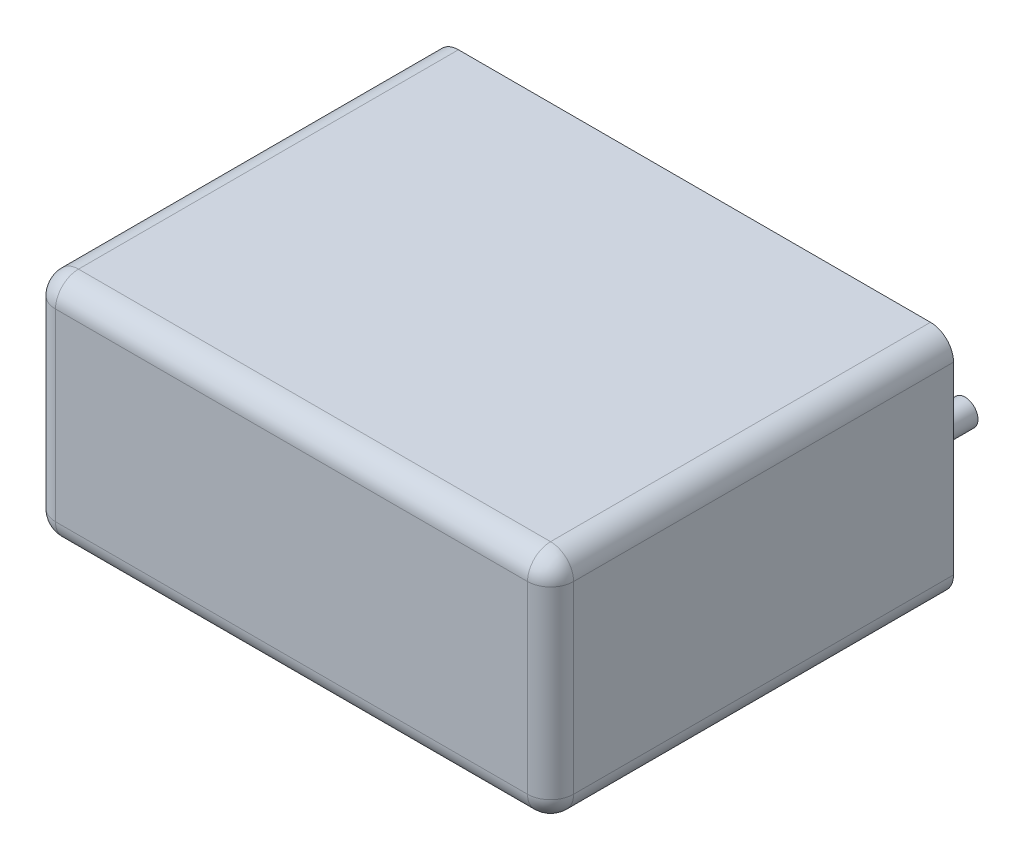
ISO-10303-21;
HEADER;
FILE_DESCRIPTION(('STEP AP214'),'2;1');
FILE_NAME('part.step','',(''),(''),'','','');
FILE_SCHEMA(('AUTOMOTIVE_DESIGN { 1 0 10303 214 1 1 1 1 }'));
ENDSEC;
DATA;
#1=APPLICATION_CONTEXT('core data for automotive mechanical design processes');
#2=APPLICATION_PROTOCOL_DEFINITION('international standard','automotive_design',2000,#1);
#3=PRODUCT_CONTEXT('',#1,'mechanical');
#4=PRODUCT('Part','Part','',(#3));
#5=PRODUCT_RELATED_PRODUCT_CATEGORY('part','',(#4));
#6=PRODUCT_DEFINITION_FORMATION('','',#4);
#7=PRODUCT_DEFINITION_CONTEXT('part definition',#1,'design');
#8=PRODUCT_DEFINITION('design','',#6,#7);
#9=PRODUCT_DEFINITION_SHAPE('','',#8);
#10=(LENGTH_UNIT() NAMED_UNIT(*) SI_UNIT(.MILLI.,.METRE.));
#11=(NAMED_UNIT(*) PLANE_ANGLE_UNIT() SI_UNIT($,.RADIAN.));
#12=(NAMED_UNIT(*) SI_UNIT($,.STERADIAN.) SOLID_ANGLE_UNIT());
#13=UNCERTAINTY_MEASURE_WITH_UNIT(LENGTH_MEASURE(1.E-05),#10,'distance_accuracy_value','');
#14=(GEOMETRIC_REPRESENTATION_CONTEXT(3) GLOBAL_UNCERTAINTY_ASSIGNED_CONTEXT((#13)) GLOBAL_UNIT_ASSIGNED_CONTEXT((#10,
#11,#12)) REPRESENTATION_CONTEXT('',''));
#15=CARTESIAN_POINT('',(0.,0.,0.));
#16=DIRECTION('',(0.,0.,1.));
#17=DIRECTION('',(1.,0.,0.));
#18=AXIS2_PLACEMENT_3D('',#15,#16,#17);
#19=CARTESIAN_POINT('',(15.7,3.2,13.2));
#20=DIRECTION('',(1.,0.,0.));
#21=DIRECTION('',(0.,0.,-1.));
#22=AXIS2_PLACEMENT_3D('',#19,#20,#21);
#23=SPHERICAL_SURFACE('',#22,0.8);
#24=CARTESIAN_POINT('',(15.7,3.2,13.2));
#25=DIRECTION('',(0.,0.,-1.));
#26=DIRECTION('',(-1.,0.,0.));
#27=AXIS2_PLACEMENT_3D('',#24,#25,#26);
#28=CIRCLE('',#27,0.8);
#29=CARTESIAN_POINT('',(15.7,4.,13.2));
#30=VERTEX_POINT('',#29);
#31=CARTESIAN_POINT('',(16.5,3.2,13.2));
#32=VERTEX_POINT('',#31);
#33=EDGE_CURVE('E101',#30,#32,#28,.T.);
#34=ORIENTED_EDGE('',*,*,#33,.F.);
#35=CARTESIAN_POINT('',(15.7,3.2,13.2));
#36=DIRECTION('',(1.,0.,0.));
#37=DIRECTION('',(0.,0.,-1.));
#38=AXIS2_PLACEMENT_3D('',#35,#36,#37);
#39=CIRCLE('',#38,0.8);
#40=CARTESIAN_POINT('',(15.7,3.2,14.));
#41=VERTEX_POINT('',#40);
#42=EDGE_CURVE('E263',#41,#30,#39,.F.);
#43=ORIENTED_EDGE('',*,*,#42,.F.);
#44=CARTESIAN_POINT('',(15.7,3.2,13.2));
#45=DIRECTION('',(0.,1.,0.));
#46=DIRECTION('',(0.,0.,1.));
#47=AXIS2_PLACEMENT_3D('',#44,#45,#46);
#48=CIRCLE('',#47,0.8);
#49=EDGE_CURVE('E250',#32,#41,#48,.F.);
#50=ORIENTED_EDGE('',*,*,#49,.F.);
#51=EDGE_LOOP('',(#34,#43,#50));
#52=FACE_BOUND('',#51,.T.);
#53=ADVANCED_FACE('F17',(#52),#23,.T.);
#54=CARTESIAN_POINT('',(-0.7,3.2,13.2));
#55=DIRECTION('',(1.,0.,0.));
#56=DIRECTION('',(0.,0.,-1.));
#57=AXIS2_PLACEMENT_3D('',#54,#55,#56);
#58=SPHERICAL_SURFACE('',#57,0.8);
#59=CARTESIAN_POINT('',(-0.7,3.2,13.2));
#60=DIRECTION('',(1.,0.,0.));
#61=DIRECTION('',(0.,0.,-1.));
#62=AXIS2_PLACEMENT_3D('',#59,#60,#61);
#63=CIRCLE('',#62,0.8);
#64=CARTESIAN_POINT('',(-0.7,4.,13.2));
#65=VERTEX_POINT('',#64);
#66=CARTESIAN_POINT('',(-0.7,3.2,14.));
#67=VERTEX_POINT('',#66);
#68=EDGE_CURVE('E261',#65,#67,#63,.T.);
#69=ORIENTED_EDGE('',*,*,#68,.F.);
#70=CARTESIAN_POINT('',(-0.700000000000001,3.2,13.2));
#71=DIRECTION('',(0.,0.,1.));
#72=DIRECTION('',(1.,0.,0.));
#73=AXIS2_PLACEMENT_3D('',#70,#71,#72);
#74=CIRCLE('',#73,0.8);
#75=CARTESIAN_POINT('',(-1.5,3.2,13.2));
#76=VERTEX_POINT('',#75);
#77=EDGE_CURVE('E247',#76,#65,#74,.F.);
#78=ORIENTED_EDGE('',*,*,#77,.F.);
#79=CARTESIAN_POINT('',(-0.7,3.2,13.2));
#80=DIRECTION('',(0.,1.,0.));
#81=DIRECTION('',(0.,0.,1.));
#82=AXIS2_PLACEMENT_3D('',#79,#80,#81);
#83=CIRCLE('',#82,0.8);
#84=EDGE_CURVE('E246',#67,#76,#83,.F.);
#85=ORIENTED_EDGE('',*,*,#84,.F.);
#86=EDGE_LOOP('',(#69,#78,#85));
#87=FACE_BOUND('',#86,.T.);
#88=ADVANCED_FACE('F212',(#87),#58,.T.);
#89=CARTESIAN_POINT('',(15.,0.,-1.9));
#90=DIRECTION('',(0.,0.,-1.));
#91=DIRECTION('',(-1.,0.,0.));
#92=AXIS2_PLACEMENT_3D('',#89,#90,#91);
#93=PLANE('',#92);
#94=CARTESIAN_POINT('',(15.,0.,-1.9));
#95=DIRECTION('',(0.,0.,1.));
#96=DIRECTION('',(1.,0.,0.));
#97=AXIS2_PLACEMENT_3D('',#94,#95,#96);
#98=CIRCLE('',#97,0.45);
#99=CARTESIAN_POINT('',(15.45,0.,-1.9));
#100=VERTEX_POINT('',#99);
#101=EDGE_CURVE('E244',#100,#100,#98,.T.);
#102=ORIENTED_EDGE('',*,*,#101,.F.);
#103=EDGE_LOOP('',(#102));
#104=FACE_BOUND('',#103,.T.);
#105=ADVANCED_FACE('F209',(#104),#93,.T.);
#106=CARTESIAN_POINT('',(0.,0.,-1.9));
#107=DIRECTION('',(0.,0.,-1.));
#108=DIRECTION('',(-1.,0.,0.));
#109=AXIS2_PLACEMENT_3D('',#106,#107,#108);
#110=PLANE('',#109);
#111=CARTESIAN_POINT('',(0.,0.,-1.9));
#112=DIRECTION('',(0.,0.,1.));
#113=DIRECTION('',(1.,0.,0.));
#114=AXIS2_PLACEMENT_3D('',#111,#112,#113);
#115=CIRCLE('',#114,0.45);
#116=CARTESIAN_POINT('',(0.45,0.,-1.9));
#117=VERTEX_POINT('',#116);
#118=EDGE_CURVE('E240',#117,#117,#115,.T.);
#119=ORIENTED_EDGE('',*,*,#118,.F.);
#120=EDGE_LOOP('',(#119));
#121=FACE_BOUND('',#120,.T.);
#122=ADVANCED_FACE('F206',(#121),#110,.T.);
#123=CARTESIAN_POINT('',(15.7,3.2,0.));
#124=DIRECTION('',(0.,0.,-1.));
#125=DIRECTION('',(-1.,0.,0.));
#126=AXIS2_PLACEMENT_3D('',#123,#124,#125);
#127=CYLINDRICAL_SURFACE('',#126,0.8);
#128=ORIENTED_EDGE('',*,*,#33,.T.);
#129=DIRECTION('',(0.,0.,-1.));
#130=VECTOR('',#129,1.);
#131=CARTESIAN_POINT('',(16.5,3.2,14.));
#132=LINE('',#131,#130);
#133=CARTESIAN_POINT('',(16.5,3.2,0.));
#134=VERTEX_POINT('',#133);
#135=EDGE_CURVE('E99',#134,#32,#132,.F.);
#136=ORIENTED_EDGE('',*,*,#135,.F.);
#137=CARTESIAN_POINT('',(15.7,3.2,0.));
#138=DIRECTION('',(0.,0.,-1.));
#139=DIRECTION('',(-1.,0.,0.));
#140=AXIS2_PLACEMENT_3D('',#137,#138,#139);
#141=CIRCLE('',#140,0.8);
#142=CARTESIAN_POINT('',(15.7,4.,0.));
#143=VERTEX_POINT('',#142);
#144=EDGE_CURVE('E21',#134,#143,#141,.F.);
#145=ORIENTED_EDGE('',*,*,#144,.T.);
#146=DIRECTION('',(0.,0.,1.));
#147=VECTOR('',#146,1.);
#148=CARTESIAN_POINT('',(15.7,4.,0.));
#149=LINE('',#148,#147);
#150=EDGE_CURVE('E97',#30,#143,#149,.F.);
#151=ORIENTED_EDGE('',*,*,#150,.F.);
#152=EDGE_LOOP('',(#128,#136,#145,#151));
#153=FACE_BOUND('',#152,.T.);
#154=ADVANCED_FACE('F96',(#153),#127,.T.);
#155=CARTESIAN_POINT('',(-0.7,3.2,0.));
#156=DIRECTION('',(0.,0.,1.));
#157=DIRECTION('',(1.,0.,0.));
#158=AXIS2_PLACEMENT_3D('',#155,#156,#157);
#159=CYLINDRICAL_SURFACE('',#158,0.8);
#160=ORIENTED_EDGE('',*,*,#77,.T.);
#161=DIRECTION('',(0.,0.,1.));
#162=VECTOR('',#161,1.);
#163=CARTESIAN_POINT('',(-0.7,4.,0.));
#164=LINE('',#163,#162);
#165=CARTESIAN_POINT('',(-0.7,4.,0.));
#166=VERTEX_POINT('',#165);
#167=EDGE_CURVE('E243',#166,#65,#164,.T.);
#168=ORIENTED_EDGE('',*,*,#167,.F.);
#169=CARTESIAN_POINT('',(-0.7,3.2,0.));
#170=DIRECTION('',(0.,0.,1.));
#171=DIRECTION('',(1.,0.,0.));
#172=AXIS2_PLACEMENT_3D('',#169,#170,#171);
#173=CIRCLE('',#172,0.8);
#174=CARTESIAN_POINT('',(-1.5,3.2,0.));
#175=VERTEX_POINT('',#174);
#176=EDGE_CURVE('E116',#166,#175,#173,.T.);
#177=ORIENTED_EDGE('',*,*,#176,.T.);
#178=DIRECTION('',(0.,0.,1.));
#179=VECTOR('',#178,1.);
#180=CARTESIAN_POINT('',(-1.5,3.2,0.));
#181=LINE('',#180,#179);
#182=EDGE_CURVE('E285',#76,#175,#181,.F.);
#183=ORIENTED_EDGE('',*,*,#182,.F.);
#184=EDGE_LOOP('',(#160,#168,#177,#183));
#185=FACE_BOUND('',#184,.T.);
#186=ADVANCED_FACE('F199',(#185),#159,.T.);
#187=CARTESIAN_POINT('',(15.7,-4.,13.2));
#188=DIRECTION('',(0.,1.,0.));
#189=DIRECTION('',(0.,0.,1.));
#190=AXIS2_PLACEMENT_3D('',#187,#188,#189);
#191=CYLINDRICAL_SURFACE('',#190,0.8);
#192=ORIENTED_EDGE('',*,*,#49,.T.);
#193=DIRECTION('',(0.,1.,0.));
#194=VECTOR('',#193,1.);
#195=CARTESIAN_POINT('',(15.7,-4.,14.));
#196=LINE('',#195,#194);
#197=CARTESIAN_POINT('',(15.7,-3.2,14.));
#198=VERTEX_POINT('',#197);
#199=EDGE_CURVE('E277',#198,#41,#196,.T.);
#200=ORIENTED_EDGE('',*,*,#199,.F.);
#201=CARTESIAN_POINT('',(15.7,-3.2,13.2));
#202=DIRECTION('',(0.,-1.,0.));
#203=DIRECTION('',(1.,0.,0.));
#204=AXIS2_PLACEMENT_3D('',#201,#202,#203);
#205=CIRCLE('',#204,0.8);
#206=CARTESIAN_POINT('',(16.5,-3.2,13.2));
#207=VERTEX_POINT('',#206);
#208=EDGE_CURVE('E319',#207,#198,#205,.T.);
#209=ORIENTED_EDGE('',*,*,#208,.F.);
#210=DIRECTION('',(0.,1.,0.));
#211=VECTOR('',#210,1.);
#212=CARTESIAN_POINT('',(16.5,-4.,13.2));
#213=LINE('',#212,#211);
#214=EDGE_CURVE('E286',#32,#207,#213,.F.);
#215=ORIENTED_EDGE('',*,*,#214,.F.);
#216=EDGE_LOOP('',(#192,#200,#209,#215));
#217=FACE_BOUND('',#216,.T.);
#218=ADVANCED_FACE('F195',(#217),#191,.T.);
#219=CARTESIAN_POINT('',(0.,3.2,13.2));
#220=DIRECTION('',(1.,0.,0.));
#221=DIRECTION('',(0.,0.,-1.));
#222=AXIS2_PLACEMENT_3D('',#219,#220,#221);
#223=CYLINDRICAL_SURFACE('',#222,0.8);
#224=ORIENTED_EDGE('',*,*,#68,.T.);
#225=DIRECTION('',(1.,0.,0.));
#226=VECTOR('',#225,1.);
#227=CARTESIAN_POINT('',(-1.5,3.2,14.));
#228=LINE('',#227,#226);
#229=EDGE_CURVE('E224',#41,#67,#228,.F.);
#230=ORIENTED_EDGE('',*,*,#229,.F.);
#231=ORIENTED_EDGE('',*,*,#42,.T.);
#232=DIRECTION('',(1.,0.,0.));
#233=VECTOR('',#232,1.);
#234=CARTESIAN_POINT('',(0.,4.,13.2));
#235=LINE('',#234,#233);
#236=EDGE_CURVE('E109',#65,#30,#235,.T.);
#237=ORIENTED_EDGE('',*,*,#236,.F.);
#238=EDGE_LOOP('',(#224,#230,#231,#237));
#239=FACE_BOUND('',#238,.T.);
#240=ADVANCED_FACE('F191',(#239),#223,.T.);
#241=CARTESIAN_POINT('',(-0.7,-4.,13.2));
#242=DIRECTION('',(0.,1.,0.));
#243=DIRECTION('',(0.,0.,1.));
#244=AXIS2_PLACEMENT_3D('',#241,#242,#243);
#245=CYLINDRICAL_SURFACE('',#244,0.8);
#246=ORIENTED_EDGE('',*,*,#84,.T.);
#247=DIRECTION('',(0.,1.,0.));
#248=VECTOR('',#247,1.);
#249=CARTESIAN_POINT('',(-1.5,-4.,13.2));
#250=LINE('',#249,#248);
#251=CARTESIAN_POINT('',(-1.5,-3.2,13.2));
#252=VERTEX_POINT('',#251);
#253=EDGE_CURVE('E282',#252,#76,#250,.T.);
#254=ORIENTED_EDGE('',*,*,#253,.F.);
#255=CARTESIAN_POINT('',(-0.7,-3.2,13.2));
#256=DIRECTION('',(0.,1.,0.));
#257=DIRECTION('',(0.,0.,1.));
#258=AXIS2_PLACEMENT_3D('',#255,#256,#257);
#259=CIRCLE('',#258,0.8);
#260=CARTESIAN_POINT('',(-0.7,-3.2,14.));
#261=VERTEX_POINT('',#260);
#262=EDGE_CURVE('E262',#252,#261,#259,.T.);
#263=ORIENTED_EDGE('',*,*,#262,.T.);
#264=DIRECTION('',(0.,1.,0.));
#265=VECTOR('',#264,1.);
#266=CARTESIAN_POINT('',(-0.7,-4.,14.));
#267=LINE('',#266,#265);
#268=EDGE_CURVE('E138',#67,#261,#267,.F.);
#269=ORIENTED_EDGE('',*,*,#268,.F.);
#270=EDGE_LOOP('',(#246,#254,#263,#269));
#271=FACE_BOUND('',#270,.T.);
#272=ADVANCED_FACE('F187',(#271),#245,.T.);
#273=CARTESIAN_POINT('',(15.,0.,-1.9));
#274=DIRECTION('',(0.,0.,1.));
#275=DIRECTION('',(1.,0.,0.));
#276=AXIS2_PLACEMENT_3D('',#273,#274,#275);
#277=CYLINDRICAL_SURFACE('',#276,0.45);
#278=CARTESIAN_POINT('',(15.,0.,0.));
#279=DIRECTION('',(0.,0.,1.));
#280=DIRECTION('',(1.,0.,0.));
#281=AXIS2_PLACEMENT_3D('',#278,#279,#280);
#282=CIRCLE('',#281,0.45);
#283=CARTESIAN_POINT('',(15.45,0.,0.));
#284=VERTEX_POINT('',#283);
#285=EDGE_CURVE('E237',#284,#284,#282,.T.);
#286=ORIENTED_EDGE('',*,*,#285,.F.);
#287=EDGE_LOOP('',(#286));
#288=FACE_BOUND('',#287,.T.);
#289=ORIENTED_EDGE('',*,*,#101,.T.);
#290=EDGE_LOOP('',(#289));
#291=FACE_BOUND('',#290,.T.);
#292=ADVANCED_FACE('F183',(#288,#291),#277,.T.);
#293=CARTESIAN_POINT('',(0.,0.,-1.9));
#294=DIRECTION('',(0.,0.,1.));
#295=DIRECTION('',(1.,0.,0.));
#296=AXIS2_PLACEMENT_3D('',#293,#294,#295);
#297=CYLINDRICAL_SURFACE('',#296,0.45);
#298=CARTESIAN_POINT('',(0.,0.,0.));
#299=DIRECTION('',(0.,0.,1.));
#300=DIRECTION('',(1.,0.,0.));
#301=AXIS2_PLACEMENT_3D('',#298,#299,#300);
#302=CIRCLE('',#301,0.45);
#303=CARTESIAN_POINT('',(0.45,0.,0.));
#304=VERTEX_POINT('',#303);
#305=EDGE_CURVE('E123',#304,#304,#302,.T.);
#306=ORIENTED_EDGE('',*,*,#305,.F.);
#307=EDGE_LOOP('',(#306));
#308=FACE_BOUND('',#307,.T.);
#309=ORIENTED_EDGE('',*,*,#118,.T.);
#310=EDGE_LOOP('',(#309));
#311=FACE_BOUND('',#310,.T.);
#312=ADVANCED_FACE('F180',(#308,#311),#297,.T.);
#313=CARTESIAN_POINT('',(0.,4.,0.));
#314=DIRECTION('',(0.,1.,0.));
#315=DIRECTION('',(0.,0.,1.));
#316=AXIS2_PLACEMENT_3D('',#313,#314,#315);
#317=PLANE('',#316);
#318=ORIENTED_EDGE('',*,*,#236,.T.);
#319=ORIENTED_EDGE('',*,*,#150,.T.);
#320=DIRECTION('',(-1.,0.,0.));
#321=VECTOR('',#320,1.);
#322=CARTESIAN_POINT('',(16.5,4.,0.));
#323=LINE('',#322,#321);
#324=EDGE_CURVE('E107',#166,#143,#323,.F.);
#325=ORIENTED_EDGE('',*,*,#324,.F.);
#326=ORIENTED_EDGE('',*,*,#167,.T.);
#327=EDGE_LOOP('',(#318,#319,#325,#326));
#328=FACE_BOUND('',#327,.T.);
#329=ADVANCED_FACE('F105',(#328),#317,.T.);
#330=CARTESIAN_POINT('',(16.5,-4.,14.));
#331=DIRECTION('',(1.,0.,0.));
#332=DIRECTION('',(0.,0.,-1.));
#333=AXIS2_PLACEMENT_3D('',#330,#331,#332);
#334=PLANE('',#333);
#335=ORIENTED_EDGE('',*,*,#214,.T.);
#336=DIRECTION('',(0.,0.,1.));
#337=VECTOR('',#336,1.);
#338=CARTESIAN_POINT('',(16.5,-3.2,14.));
#339=LINE('',#338,#337);
#340=CARTESIAN_POINT('',(16.5,-3.2,0.));
#341=VERTEX_POINT('',#340);
#342=EDGE_CURVE('E137',#341,#207,#339,.T.);
#343=ORIENTED_EDGE('',*,*,#342,.F.);
#344=DIRECTION('',(0.,1.,0.));
#345=VECTOR('',#344,1.);
#346=CARTESIAN_POINT('',(16.5,-4.,0.));
#347=LINE('',#346,#345);
#348=EDGE_CURVE('E118',#134,#341,#347,.F.);
#349=ORIENTED_EDGE('',*,*,#348,.F.);
#350=ORIENTED_EDGE('',*,*,#135,.T.);
#351=EDGE_LOOP('',(#335,#343,#349,#350));
#352=FACE_BOUND('',#351,.T.);
#353=ADVANCED_FACE('F173',(#352),#334,.T.);
#354=CARTESIAN_POINT('',(-1.5,-4.,0.));
#355=DIRECTION('',(-1.,0.,0.));
#356=DIRECTION('',(0.,0.,1.));
#357=AXIS2_PLACEMENT_3D('',#354,#355,#356);
#358=PLANE('',#357);
#359=DIRECTION('',(0.,1.,0.));
#360=VECTOR('',#359,1.);
#361=CARTESIAN_POINT('',(-1.5,-4.,0.));
#362=LINE('',#361,#360);
#363=CARTESIAN_POINT('',(-1.5,-3.2,0.));
#364=VERTEX_POINT('',#363);
#365=EDGE_CURVE('E119',#364,#175,#362,.T.);
#366=ORIENTED_EDGE('',*,*,#365,.F.);
#367=DIRECTION('',(0.,0.,-1.));
#368=VECTOR('',#367,1.);
#369=CARTESIAN_POINT('',(-1.5,-3.2,0.));
#370=LINE('',#369,#368);
#371=EDGE_CURVE('E145',#252,#364,#370,.T.);
#372=ORIENTED_EDGE('',*,*,#371,.F.);
#373=ORIENTED_EDGE('',*,*,#253,.T.);
#374=ORIENTED_EDGE('',*,*,#182,.T.);
#375=EDGE_LOOP('',(#366,#372,#373,#374));
#376=FACE_BOUND('',#375,.T.);
#377=ADVANCED_FACE('F169',(#376),#358,.T.);
#378=CARTESIAN_POINT('',(15.7,-3.2,13.2));
#379=DIRECTION('',(1.,0.,0.));
#380=DIRECTION('',(0.,0.,-1.));
#381=AXIS2_PLACEMENT_3D('',#378,#379,#380);
#382=SPHERICAL_SURFACE('',#381,0.8);
#383=CARTESIAN_POINT('',(15.7,-3.2,13.2));
#384=DIRECTION('',(0.,0.,1.));
#385=DIRECTION('',(1.,0.,0.));
#386=AXIS2_PLACEMENT_3D('',#383,#384,#385);
#387=CIRCLE('',#386,0.8);
#388=CARTESIAN_POINT('',(15.7,-4.,13.2));
#389=VERTEX_POINT('',#388);
#390=EDGE_CURVE('E135',#207,#389,#387,.F.);
#391=ORIENTED_EDGE('',*,*,#390,.F.);
#392=ORIENTED_EDGE('',*,*,#208,.T.);
#393=CARTESIAN_POINT('',(15.7,-3.2,13.2));
#394=DIRECTION('',(-1.,0.,0.));
#395=DIRECTION('',(0.,0.,1.));
#396=AXIS2_PLACEMENT_3D('',#393,#394,#395);
#397=CIRCLE('',#396,0.8);
#398=EDGE_CURVE('E141',#389,#198,#397,.T.);
#399=ORIENTED_EDGE('',*,*,#398,.F.);
#400=EDGE_LOOP('',(#391,#392,#399));
#401=FACE_BOUND('',#400,.T.);
#402=ADVANCED_FACE('F165',(#401),#382,.T.);
#403=CARTESIAN_POINT('',(-1.5,-4.,14.));
#404=DIRECTION('',(0.,0.,1.));
#405=DIRECTION('',(1.,0.,0.));
#406=AXIS2_PLACEMENT_3D('',#403,#404,#405);
#407=PLANE('',#406);
#408=ORIENTED_EDGE('',*,*,#268,.T.);
#409=DIRECTION('',(-1.,0.,0.));
#410=VECTOR('',#409,1.);
#411=CARTESIAN_POINT('',(-1.5,-3.2,14.));
#412=LINE('',#411,#410);
#413=EDGE_CURVE('E144',#198,#261,#412,.T.);
#414=ORIENTED_EDGE('',*,*,#413,.F.);
#415=ORIENTED_EDGE('',*,*,#199,.T.);
#416=ORIENTED_EDGE('',*,*,#229,.T.);
#417=EDGE_LOOP('',(#408,#414,#415,#416));
#418=FACE_BOUND('',#417,.T.);
#419=ADVANCED_FACE('F160',(#418),#407,.T.);
#420=CARTESIAN_POINT('',(-0.7,-3.2,13.2));
#421=DIRECTION('',(1.,0.,0.));
#422=DIRECTION('',(0.,0.,-1.));
#423=AXIS2_PLACEMENT_3D('',#420,#421,#422);
#424=SPHERICAL_SURFACE('',#423,0.8);
#425=CARTESIAN_POINT('',(-0.7,-3.2,13.2));
#426=DIRECTION('',(-1.,0.,0.));
#427=DIRECTION('',(0.,0.,1.));
#428=AXIS2_PLACEMENT_3D('',#425,#426,#427);
#429=CIRCLE('',#428,0.8);
#430=CARTESIAN_POINT('',(-0.7,-4.,13.2000000000098));
#431=VERTEX_POINT('',#430);
#432=EDGE_CURVE('E35',#261,#431,#429,.F.);
#433=ORIENTED_EDGE('',*,*,#432,.F.);
#434=ORIENTED_EDGE('',*,*,#262,.F.);
#435=CARTESIAN_POINT('',(-0.700000000000001,-3.2,13.2));
#436=DIRECTION('',(0.,0.,-1.));
#437=DIRECTION('',(-1.,0.,0.));
#438=AXIS2_PLACEMENT_3D('',#435,#436,#437);
#439=CIRCLE('',#438,0.8);
#440=EDGE_CURVE('E233',#431,#252,#439,.T.);
#441=ORIENTED_EDGE('',*,*,#440,.F.);
#442=EDGE_LOOP('',(#433,#434,#441));
#443=FACE_BOUND('',#442,.T.);
#444=ADVANCED_FACE('F155',(#443),#424,.T.);
#445=CARTESIAN_POINT('',(15.7,-3.2,14.));
#446=DIRECTION('',(0.,0.,1.));
#447=DIRECTION('',(1.,0.,0.));
#448=AXIS2_PLACEMENT_3D('',#445,#446,#447);
#449=CYLINDRICAL_SURFACE('',#448,0.8);
#450=CARTESIAN_POINT('',(15.7,-3.2,0.));
#451=DIRECTION('',(0.,0.,1.));
#452=DIRECTION('',(1.,0.,0.));
#453=AXIS2_PLACEMENT_3D('',#450,#451,#452);
#454=CIRCLE('',#453,0.8);
#455=CARTESIAN_POINT('',(15.7,-4.,0.));
#456=VERTEX_POINT('',#455);
#457=EDGE_CURVE('E121',#341,#456,#454,.F.);
#458=ORIENTED_EDGE('',*,*,#457,.F.);
#459=ORIENTED_EDGE('',*,*,#342,.T.);
#460=ORIENTED_EDGE('',*,*,#390,.T.);
#461=DIRECTION('',(0.,0.,1.));
#462=VECTOR('',#461,1.);
#463=CARTESIAN_POINT('',(15.7,-4.,0.));
#464=LINE('',#463,#462);
#465=EDGE_CURVE('E126',#389,#456,#464,.F.);
#466=ORIENTED_EDGE('',*,*,#465,.T.);
#467=EDGE_LOOP('',(#458,#459,#460,#466));
#468=FACE_BOUND('',#467,.T.);
#469=ADVANCED_FACE('F159',(#468),#449,.T.);
#470=CARTESIAN_POINT('',(16.5,-4.,0.));
#471=DIRECTION('',(0.,0.,-1.));
#472=DIRECTION('',(-1.,0.,0.));
#473=AXIS2_PLACEMENT_3D('',#470,#471,#472);
#474=PLANE('',#473);
#475=DIRECTION('',(1.,0.,0.));
#476=VECTOR('',#475,1.);
#477=CARTESIAN_POINT('',(0.,-4.,0.));
#478=LINE('',#477,#476);
#479=CARTESIAN_POINT('',(-0.7,-4.,0.));
#480=VERTEX_POINT('',#479);
#481=EDGE_CURVE('E129',#456,#480,#478,.F.);
#482=ORIENTED_EDGE('',*,*,#481,.T.);
#483=CARTESIAN_POINT('',(-0.7,-3.2,0.));
#484=DIRECTION('',(0.,0.,-1.));
#485=DIRECTION('',(-1.,0.,0.));
#486=AXIS2_PLACEMENT_3D('',#483,#484,#485);
#487=CIRCLE('',#486,0.8);
#488=EDGE_CURVE('E231',#364,#480,#487,.F.);
#489=ORIENTED_EDGE('',*,*,#488,.F.);
#490=ORIENTED_EDGE('',*,*,#365,.T.);
#491=ORIENTED_EDGE('',*,*,#176,.F.);
#492=ORIENTED_EDGE('',*,*,#324,.T.);
#493=ORIENTED_EDGE('',*,*,#144,.F.);
#494=ORIENTED_EDGE('',*,*,#348,.T.);
#495=ORIENTED_EDGE('',*,*,#457,.T.);
#496=EDGE_LOOP('',(#482,#489,#490,#491,#492,#493,#494,#495));
#497=FACE_BOUND('',#496,.T.);
#498=ORIENTED_EDGE('',*,*,#305,.T.);
#499=EDGE_LOOP('',(#498));
#500=FACE_BOUND('',#499,.T.);
#501=ORIENTED_EDGE('',*,*,#285,.T.);
#502=EDGE_LOOP('',(#501));
#503=FACE_BOUND('',#502,.T.);
#504=ADVANCED_FACE('F113',(#497,#500,#503),#474,.T.);
#505=CARTESIAN_POINT('',(-0.7,-3.2,0.));
#506=DIRECTION('',(0.,0.,-1.));
#507=DIRECTION('',(-1.,0.,0.));
#508=AXIS2_PLACEMENT_3D('',#505,#506,#507);
#509=CYLINDRICAL_SURFACE('',#508,0.8);
#510=ORIENTED_EDGE('',*,*,#440,.T.);
#511=ORIENTED_EDGE('',*,*,#371,.T.);
#512=ORIENTED_EDGE('',*,*,#488,.T.);
#513=DIRECTION('',(0.,0.,1.));
#514=VECTOR('',#513,1.);
#515=CARTESIAN_POINT('',(-0.7,-4.,0.));
#516=LINE('',#515,#514);
#517=EDGE_CURVE('E27',#480,#431,#516,.T.);
#518=ORIENTED_EDGE('',*,*,#517,.T.);
#519=EDGE_LOOP('',(#510,#511,#512,#518));
#520=FACE_BOUND('',#519,.T.);
#521=ADVANCED_FACE('F342',(#520),#509,.T.);
#522=CARTESIAN_POINT('',(-1.5,-3.2,13.2));
#523=DIRECTION('',(-1.,0.,0.));
#524=DIRECTION('',(0.,0.,1.));
#525=AXIS2_PLACEMENT_3D('',#522,#523,#524);
#526=CYLINDRICAL_SURFACE('',#525,0.8);
#527=ORIENTED_EDGE('',*,*,#432,.T.);
#528=DIRECTION('',(1.,0.,0.));
#529=VECTOR('',#528,1.);
#530=CARTESIAN_POINT('',(0.,-4.,13.2));
#531=LINE('',#530,#529);
#532=EDGE_CURVE('E11',#431,#389,#531,.T.);
#533=ORIENTED_EDGE('',*,*,#532,.T.);
#534=ORIENTED_EDGE('',*,*,#398,.T.);
#535=ORIENTED_EDGE('',*,*,#413,.T.);
#536=EDGE_LOOP('',(#527,#533,#534,#535));
#537=FACE_BOUND('',#536,.T.);
#538=ADVANCED_FACE('F337',(#537),#526,.T.);
#539=CARTESIAN_POINT('',(0.,-4.,0.));
#540=DIRECTION('',(0.,1.,0.));
#541=DIRECTION('',(0.,0.,1.));
#542=AXIS2_PLACEMENT_3D('',#539,#540,#541);
#543=PLANE('',#542);
#544=ORIENTED_EDGE('',*,*,#517,.F.);
#545=ORIENTED_EDGE('',*,*,#481,.F.);
#546=ORIENTED_EDGE('',*,*,#465,.F.);
#547=ORIENTED_EDGE('',*,*,#532,.F.);
#548=EDGE_LOOP('',(#544,#545,#546,#547));
#549=FACE_BOUND('',#548,.T.);
#550=ADVANCED_FACE('F340',(#549),#543,.F.);
#551=CLOSED_SHELL('',(#53,#88,#105,#122,#154,#186,#218,#240,#272,#292,#312,#329,#353,#377,#402,
#419,#444,#469,#504,#521,#538,#550));
#552=MANIFOLD_SOLID_BREP('B1',#551);
#553=ADVANCED_BREP_SHAPE_REPRESENTATION('',(#18,#552),#14);
#554=SHAPE_DEFINITION_REPRESENTATION(#9,#553);
ENDSEC;
END-ISO-10303-21;
